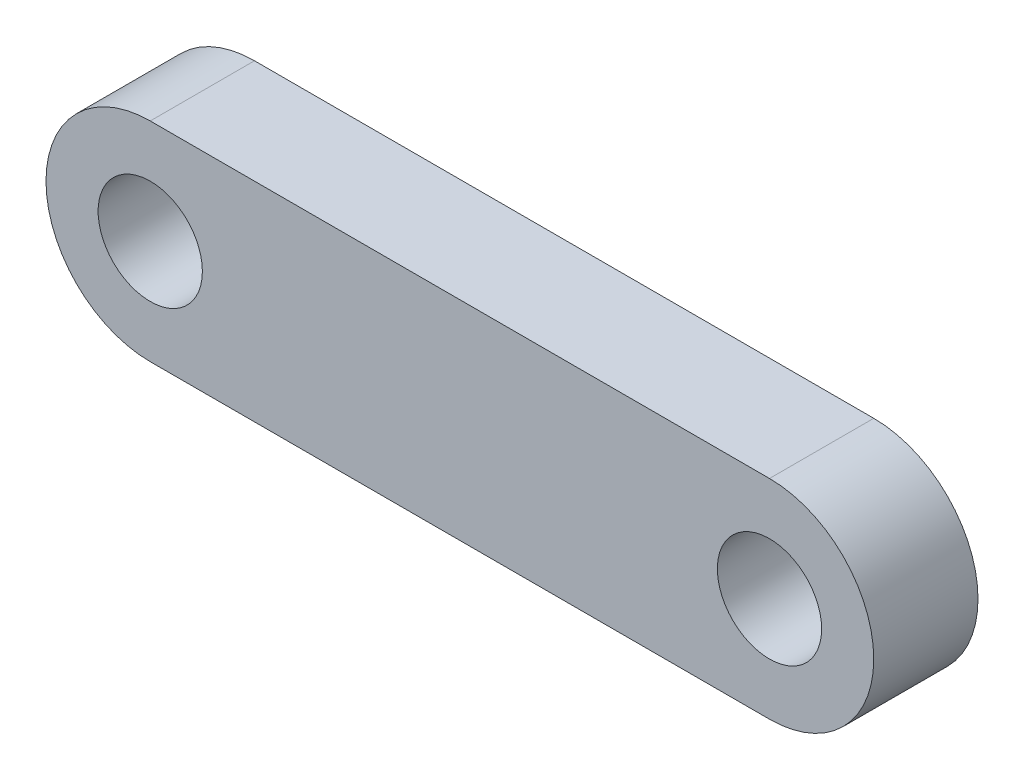
ISO-10303-21;
HEADER;
FILE_DESCRIPTION(('STEP AP214'),'2;1');
FILE_NAME('part.step','',(''),(''),'','','');
FILE_SCHEMA(('AUTOMOTIVE_DESIGN { 1 0 10303 214 1 1 1 1 }'));
ENDSEC;
DATA;
#1=APPLICATION_CONTEXT('core data for automotive mechanical design processes');
#2=APPLICATION_PROTOCOL_DEFINITION('international standard','automotive_design',2000,#1);
#3=PRODUCT_CONTEXT('',#1,'mechanical');
#4=PRODUCT('Part','Part','',(#3));
#5=PRODUCT_RELATED_PRODUCT_CATEGORY('part','',(#4));
#6=PRODUCT_DEFINITION_FORMATION('','',#4);
#7=PRODUCT_DEFINITION_CONTEXT('part definition',#1,'design');
#8=PRODUCT_DEFINITION('design','',#6,#7);
#9=PRODUCT_DEFINITION_SHAPE('','',#8);
#10=(LENGTH_UNIT() NAMED_UNIT(*) SI_UNIT(.MILLI.,.METRE.));
#11=(NAMED_UNIT(*) PLANE_ANGLE_UNIT() SI_UNIT($,.RADIAN.));
#12=(NAMED_UNIT(*) SI_UNIT($,.STERADIAN.) SOLID_ANGLE_UNIT());
#13=UNCERTAINTY_MEASURE_WITH_UNIT(LENGTH_MEASURE(1.E-05),#10,'distance_accuracy_value','');
#14=(GEOMETRIC_REPRESENTATION_CONTEXT(3) GLOBAL_UNCERTAINTY_ASSIGNED_CONTEXT((#13)) GLOBAL_UNIT_ASSIGNED_CONTEXT((#10,
#11,#12)) REPRESENTATION_CONTEXT('',''));
#15=CARTESIAN_POINT('',(0.,0.,0.));
#16=DIRECTION('',(0.,0.,1.));
#17=DIRECTION('',(1.,0.,0.));
#18=AXIS2_PLACEMENT_3D('',#15,#16,#17);
#19=CARTESIAN_POINT('',(-5.93999999209296,0.000306489254826276,2.));
#20=DIRECTION('',(0.,0.,1.));
#21=DIRECTION('',(1.,0.,0.));
#22=AXIS2_PLACEMENT_3D('',#19,#20,#21);
#23=PLANE('',#22);
#24=CARTESIAN_POINT('',(-5.93999999209296,0.000306489254826276,2.));
#25=DIRECTION('',(0.,0.,1.));
#26=DIRECTION('',(1.,0.,0.));
#27=AXIS2_PLACEMENT_3D('',#24,#25,#26);
#28=CIRCLE('',#27,1.);
#29=CARTESIAN_POINT('',(-4.93999999209296,0.000306489254826276,2.));
#30=VERTEX_POINT('',#29);
#31=EDGE_CURVE('E100',#30,#30,#28,.T.);
#32=ORIENTED_EDGE('',*,*,#31,.F.);
#33=EDGE_LOOP('',(#32));
#34=FACE_BOUND('',#33,.T.);
#35=CARTESIAN_POINT('',(-5.93999999209296,0.000306489254826276,2.));
#36=DIRECTION('',(0.,0.,1.));
#37=DIRECTION('',(1.,0.,0.));
#38=AXIS2_PLACEMENT_3D('',#35,#36,#37);
#39=CIRCLE('',#38,2.);
#40=CARTESIAN_POINT('',(-5.93999999209296,2.00030648925483,2.));
#41=VERTEX_POINT('',#40);
#42=CARTESIAN_POINT('',(-5.93999999209296,-1.99969351074517,2.));
#43=VERTEX_POINT('',#42);
#44=EDGE_CURVE('E85',#41,#43,#39,.T.);
#45=ORIENTED_EDGE('',*,*,#44,.T.);
#46=DIRECTION('',(1.,0.,0.));
#47=VECTOR('',#46,1.);
#48=CARTESIAN_POINT('',(-5.93999999209296,-1.99969351074517,2.));
#49=LINE('',#48,#47);
#50=CARTESIAN_POINT('',(5.94000000790704,-1.99969351074517,2.));
#51=VERTEX_POINT('',#50);
#52=EDGE_CURVE('E80',#43,#51,#49,.T.);
#53=ORIENTED_EDGE('',*,*,#52,.T.);
#54=CARTESIAN_POINT('',(5.94000000790704,0.000306489254826276,2.));
#55=DIRECTION('',(0.,0.,1.));
#56=DIRECTION('',(1.,0.,0.));
#57=AXIS2_PLACEMENT_3D('',#54,#55,#56);
#58=CIRCLE('',#57,2.);
#59=CARTESIAN_POINT('',(5.94000000790704,2.00030648925483,2.));
#60=VERTEX_POINT('',#59);
#61=EDGE_CURVE('E83',#51,#60,#58,.T.);
#62=ORIENTED_EDGE('',*,*,#61,.T.);
#63=DIRECTION('',(-1.,0.,0.));
#64=VECTOR('',#63,1.);
#65=CARTESIAN_POINT('',(-5.93999999209296,2.00030648925483,2.));
#66=LINE('',#65,#64);
#67=EDGE_CURVE('E50',#60,#41,#66,.T.);
#68=ORIENTED_EDGE('',*,*,#67,.T.);
#69=EDGE_LOOP('',(#45,#53,#62,#68));
#70=FACE_BOUND('',#69,.T.);
#71=CARTESIAN_POINT('',(5.94000000790704,0.000306489254826276,2.));
#72=DIRECTION('',(0.,0.,1.));
#73=DIRECTION('',(1.,0.,0.));
#74=AXIS2_PLACEMENT_3D('',#71,#72,#73);
#75=CIRCLE('',#74,1.);
#76=CARTESIAN_POINT('',(6.94000000790704,0.000306489254826276,2.));
#77=VERTEX_POINT('',#76);
#78=EDGE_CURVE('E115',#77,#77,#75,.T.);
#79=ORIENTED_EDGE('',*,*,#78,.F.);
#80=EDGE_LOOP('',(#79));
#81=FACE_BOUND('',#80,.T.);
#82=ADVANCED_FACE('F33',(#34,#70,#81),#23,.T.);
#83=CARTESIAN_POINT('',(-5.93999999209296,0.000306489254826276,0.));
#84=DIRECTION('',(0.,0.,1.));
#85=DIRECTION('',(1.,0.,0.));
#86=AXIS2_PLACEMENT_3D('',#83,#84,#85);
#87=PLANE('',#86);
#88=CARTESIAN_POINT('',(-5.93999999209296,0.000306489254826276,0.));
#89=DIRECTION('',(0.,0.,1.));
#90=DIRECTION('',(1.,0.,0.));
#91=AXIS2_PLACEMENT_3D('',#88,#89,#90);
#92=CIRCLE('',#91,2.);
#93=CARTESIAN_POINT('',(-5.93999999209296,2.00030648925483,0.));
#94=VERTEX_POINT('',#93);
#95=CARTESIAN_POINT('',(-5.93999999209296,-1.99969351074517,0.));
#96=VERTEX_POINT('',#95);
#97=EDGE_CURVE('E97',#94,#96,#92,.T.);
#98=ORIENTED_EDGE('',*,*,#97,.F.);
#99=DIRECTION('',(-1.,0.,0.));
#100=VECTOR('',#99,1.);
#101=CARTESIAN_POINT('',(-5.93999999209296,2.00030648925483,0.));
#102=LINE('',#101,#100);
#103=CARTESIAN_POINT('',(5.94000000790704,2.00030648925483,0.));
#104=VERTEX_POINT('',#103);
#105=EDGE_CURVE('E73',#104,#94,#102,.T.);
#106=ORIENTED_EDGE('',*,*,#105,.F.);
#107=CARTESIAN_POINT('',(5.94000000790704,0.000306489254826276,0.));
#108=DIRECTION('',(0.,0.,1.));
#109=DIRECTION('',(1.,0.,0.));
#110=AXIS2_PLACEMENT_3D('',#107,#108,#109);
#111=CIRCLE('',#110,2.);
#112=CARTESIAN_POINT('',(5.94000000790704,-1.99969351074517,0.));
#113=VERTEX_POINT('',#112);
#114=EDGE_CURVE('E67',#113,#104,#111,.T.);
#115=ORIENTED_EDGE('',*,*,#114,.F.);
#116=DIRECTION('',(1.,0.,0.));
#117=VECTOR('',#116,1.);
#118=CARTESIAN_POINT('',(-5.93999999209296,-1.99969351074517,0.));
#119=LINE('',#118,#117);
#120=EDGE_CURVE('E89',#96,#113,#119,.T.);
#121=ORIENTED_EDGE('',*,*,#120,.F.);
#122=EDGE_LOOP('',(#98,#106,#115,#121));
#123=FACE_BOUND('',#122,.T.);
#124=CARTESIAN_POINT('',(-5.93999999209296,0.000306489254826276,0.));
#125=DIRECTION('',(0.,0.,1.));
#126=DIRECTION('',(1.,0.,0.));
#127=AXIS2_PLACEMENT_3D('',#124,#125,#126);
#128=CIRCLE('',#127,1.);
#129=CARTESIAN_POINT('',(-4.93999999209296,0.000306489254826276,0.));
#130=VERTEX_POINT('',#129);
#131=EDGE_CURVE('E112',#130,#130,#128,.T.);
#132=ORIENTED_EDGE('',*,*,#131,.T.);
#133=EDGE_LOOP('',(#132));
#134=FACE_BOUND('',#133,.T.);
#135=CARTESIAN_POINT('',(5.94000000790704,0.000306489254826276,0.));
#136=DIRECTION('',(0.,0.,1.));
#137=DIRECTION('',(1.,0.,0.));
#138=AXIS2_PLACEMENT_3D('',#135,#136,#137);
#139=CIRCLE('',#138,1.);
#140=CARTESIAN_POINT('',(6.94000000790704,0.000306489254826276,0.));
#141=VERTEX_POINT('',#140);
#142=EDGE_CURVE('E118',#141,#141,#139,.T.);
#143=ORIENTED_EDGE('',*,*,#142,.T.);
#144=EDGE_LOOP('',(#143));
#145=FACE_BOUND('',#144,.T.);
#146=ADVANCED_FACE('F108',(#123,#134,#145),#87,.F.);
#147=CARTESIAN_POINT('',(-5.93999999209296,0.000306489254826276,2.));
#148=DIRECTION('',(0.,0.,-1.));
#149=DIRECTION('',(-1.,0.,0.));
#150=AXIS2_PLACEMENT_3D('',#147,#148,#149);
#151=CYLINDRICAL_SURFACE('',#150,2.);
#152=ORIENTED_EDGE('',*,*,#97,.T.);
#153=DIRECTION('',(0.,0.,-1.));
#154=VECTOR('',#153,1.);
#155=CARTESIAN_POINT('',(-5.93999999209296,-1.99969351074517,2.));
#156=LINE('',#155,#154);
#157=EDGE_CURVE('E11',#43,#96,#156,.T.);
#158=ORIENTED_EDGE('',*,*,#157,.F.);
#159=ORIENTED_EDGE('',*,*,#44,.F.);
#160=DIRECTION('',(0.,0.,-1.));
#161=VECTOR('',#160,1.);
#162=CARTESIAN_POINT('',(-5.93999999209296,2.00030648925483,2.));
#163=LINE('',#162,#161);
#164=EDGE_CURVE('E93',#41,#94,#163,.T.);
#165=ORIENTED_EDGE('',*,*,#164,.T.);
#166=EDGE_LOOP('',(#152,#158,#159,#165));
#167=FACE_BOUND('',#166,.T.);
#168=ADVANCED_FACE('F35',(#167),#151,.T.);
#169=CARTESIAN_POINT('',(-5.93999999209296,-1.99969351074517,2.));
#170=DIRECTION('',(0.,1.,0.));
#171=DIRECTION('',(0.,0.,1.));
#172=AXIS2_PLACEMENT_3D('',#169,#170,#171);
#173=PLANE('',#172);
#174=ORIENTED_EDGE('',*,*,#120,.T.);
#175=DIRECTION('',(0.,0.,-1.));
#176=VECTOR('',#175,1.);
#177=CARTESIAN_POINT('',(5.94000000790704,-1.99969351074517,2.));
#178=LINE('',#177,#176);
#179=EDGE_CURVE('E42',#51,#113,#178,.T.);
#180=ORIENTED_EDGE('',*,*,#179,.F.);
#181=ORIENTED_EDGE('',*,*,#52,.F.);
#182=ORIENTED_EDGE('',*,*,#157,.T.);
#183=EDGE_LOOP('',(#174,#180,#181,#182));
#184=FACE_BOUND('',#183,.T.);
#185=ADVANCED_FACE('F88',(#184),#173,.F.);
#186=CARTESIAN_POINT('',(5.94000000790704,0.000306489254826276,2.));
#187=DIRECTION('',(0.,0.,-1.));
#188=DIRECTION('',(-1.,0.,0.));
#189=AXIS2_PLACEMENT_3D('',#186,#187,#188);
#190=CYLINDRICAL_SURFACE('',#189,2.);
#191=ORIENTED_EDGE('',*,*,#114,.T.);
#192=DIRECTION('',(0.,0.,-1.));
#193=VECTOR('',#192,1.);
#194=CARTESIAN_POINT('',(5.94000000790704,2.00030648925483,2.));
#195=LINE('',#194,#193);
#196=EDGE_CURVE('E90',#60,#104,#195,.T.);
#197=ORIENTED_EDGE('',*,*,#196,.F.);
#198=ORIENTED_EDGE('',*,*,#61,.F.);
#199=ORIENTED_EDGE('',*,*,#179,.T.);
#200=EDGE_LOOP('',(#191,#197,#198,#199));
#201=FACE_BOUND('',#200,.T.);
#202=ADVANCED_FACE('F91',(#201),#190,.T.);
#203=CARTESIAN_POINT('',(-5.93999999209296,2.00030648925483,2.));
#204=DIRECTION('',(0.,-1.,0.));
#205=DIRECTION('',(0.,0.,-1.));
#206=AXIS2_PLACEMENT_3D('',#203,#204,#205);
#207=PLANE('',#206);
#208=ORIENTED_EDGE('',*,*,#105,.T.);
#209=ORIENTED_EDGE('',*,*,#164,.F.);
#210=ORIENTED_EDGE('',*,*,#67,.F.);
#211=ORIENTED_EDGE('',*,*,#196,.T.);
#212=EDGE_LOOP('',(#208,#209,#210,#211));
#213=FACE_BOUND('',#212,.T.);
#214=ADVANCED_FACE('F105',(#213),#207,.F.);
#215=CARTESIAN_POINT('',(-5.93999999209296,0.000306489254826276,2.));
#216=DIRECTION('',(0.,0.,-1.));
#217=DIRECTION('',(-1.,0.,0.));
#218=AXIS2_PLACEMENT_3D('',#215,#216,#217);
#219=CYLINDRICAL_SURFACE('',#218,1.);
#220=ORIENTED_EDGE('',*,*,#31,.T.);
#221=EDGE_LOOP('',(#220));
#222=FACE_BOUND('',#221,.T.);
#223=ORIENTED_EDGE('',*,*,#131,.F.);
#224=EDGE_LOOP('',(#223));
#225=FACE_BOUND('',#224,.T.);
#226=ADVANCED_FACE('F135',(#222,#225),#219,.F.);
#227=CARTESIAN_POINT('',(5.94000000790704,0.000306489254826276,2.));
#228=DIRECTION('',(0.,0.,-1.));
#229=DIRECTION('',(-1.,0.,0.));
#230=AXIS2_PLACEMENT_3D('',#227,#228,#229);
#231=CYLINDRICAL_SURFACE('',#230,1.);
#232=ORIENTED_EDGE('',*,*,#78,.T.);
#233=EDGE_LOOP('',(#232));
#234=FACE_BOUND('',#233,.T.);
#235=ORIENTED_EDGE('',*,*,#142,.F.);
#236=EDGE_LOOP('',(#235));
#237=FACE_BOUND('',#236,.T.);
#238=ADVANCED_FACE('F124',(#234,#237),#231,.F.);
#239=CLOSED_SHELL('',(#82,#146,#168,#185,#202,#214,#226,#238));
#240=MANIFOLD_SOLID_BREP('B2',#239);
#241=ADVANCED_BREP_SHAPE_REPRESENTATION('',(#18,#240),#14);
#242=SHAPE_DEFINITION_REPRESENTATION(#9,#241);
ENDSEC;
END-ISO-10303-21;
